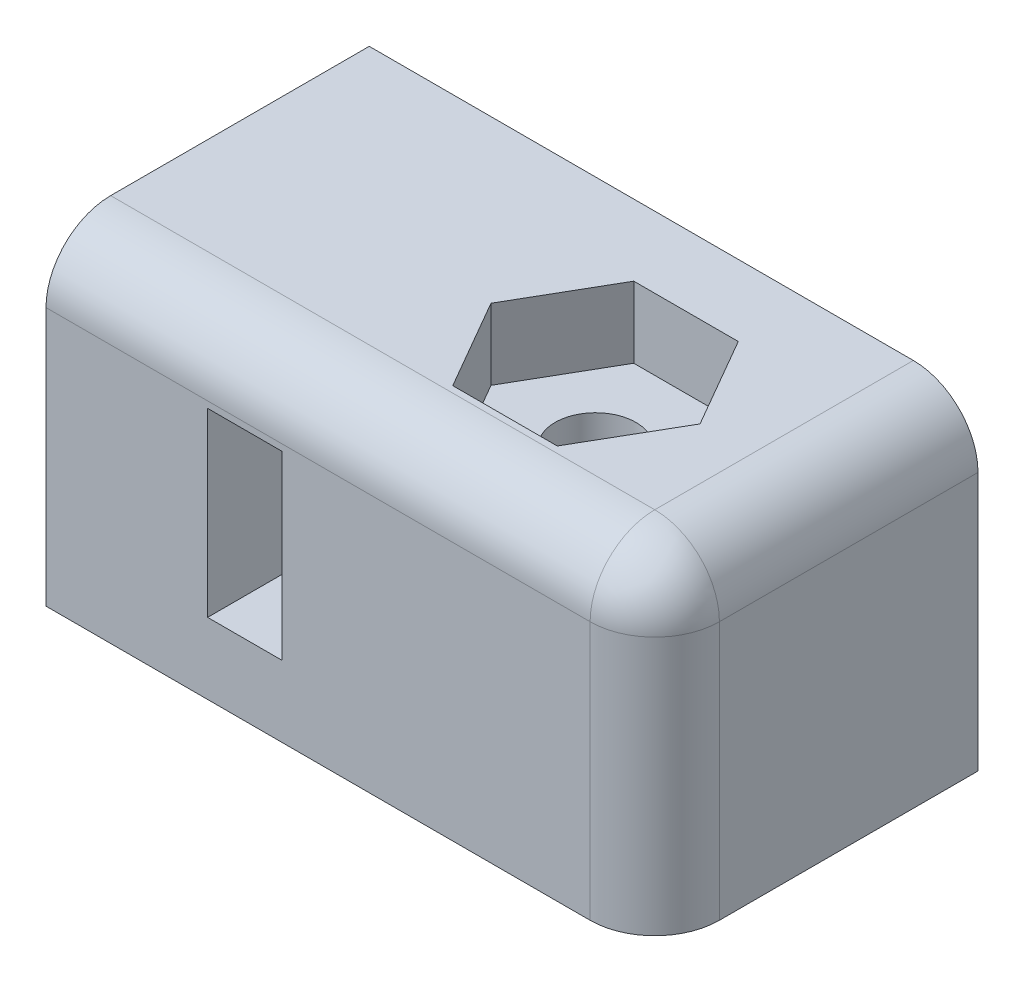
ISO-10303-21;
HEADER;
FILE_DESCRIPTION(('STEP AP214'),'2;1');
FILE_NAME('part.step','',(''),(''),'','','');
FILE_SCHEMA(('AUTOMOTIVE_DESIGN { 1 0 10303 214 1 1 1 1 }'));
ENDSEC;
DATA;
#1=APPLICATION_CONTEXT('core data for automotive mechanical design processes');
#2=APPLICATION_PROTOCOL_DEFINITION('international standard','automotive_design',2000,#1);
#3=PRODUCT_CONTEXT('',#1,'mechanical');
#4=PRODUCT('Part','Part','',(#3));
#5=PRODUCT_RELATED_PRODUCT_CATEGORY('part','',(#4));
#6=PRODUCT_DEFINITION_FORMATION('','',#4);
#7=PRODUCT_DEFINITION_CONTEXT('part definition',#1,'design');
#8=PRODUCT_DEFINITION('design','',#6,#7);
#9=PRODUCT_DEFINITION_SHAPE('','',#8);
#10=(LENGTH_UNIT() NAMED_UNIT(*) SI_UNIT(.MILLI.,.METRE.));
#11=(NAMED_UNIT(*) PLANE_ANGLE_UNIT() SI_UNIT($,.RADIAN.));
#12=(NAMED_UNIT(*) SI_UNIT($,.STERADIAN.) SOLID_ANGLE_UNIT());
#13=UNCERTAINTY_MEASURE_WITH_UNIT(LENGTH_MEASURE(1.E-05),#10,'distance_accuracy_value','');
#14=(GEOMETRIC_REPRESENTATION_CONTEXT(3) GLOBAL_UNCERTAINTY_ASSIGNED_CONTEXT((#13)) GLOBAL_UNIT_ASSIGNED_CONTEXT((#10,
#11,#12)) REPRESENTATION_CONTEXT('',''));
#15=CARTESIAN_POINT('',(0.,0.,0.));
#16=DIRECTION('',(0.,0.,1.));
#17=DIRECTION('',(1.,0.,0.));
#18=AXIS2_PLACEMENT_3D('',#15,#16,#17);
#19=CARTESIAN_POINT('',(12.,5.,-5.00000000000001));
#20=DIRECTION('',(-1.,0.,0.));
#21=DIRECTION('',(0.,0.,1.));
#22=AXIS2_PLACEMENT_3D('',#19,#20,#21);
#23=CYLINDRICAL_SURFACE('',#22,1.25);
#24=CARTESIAN_POINT('',(7.3,5.,-5.00000000000001));
#25=DIRECTION('',(1.,0.,0.));
#26=DIRECTION('',(0.,0.,-1.));
#27=AXIS2_PLACEMENT_3D('',#24,#25,#26);
#28=CIRCLE('',#27,1.25);
#29=CARTESIAN_POINT('',(7.3,5.,-6.25000000000001));
#30=VERTEX_POINT('',#29);
#31=EDGE_CURVE('E204',#30,#30,#28,.F.);
#32=ORIENTED_EDGE('',*,*,#31,.T.);
#33=EDGE_LOOP('',(#32));
#34=FACE_BOUND('',#33,.T.);
#35=CARTESIAN_POINT('',(12.,5.,-5.00000000000001));
#36=DIRECTION('',(0.707106781186547,0.707106781186547,0.));
#37=DIRECTION('',(-0.707106781186547,0.707106781186547,0.));
#38=AXIS2_PLACEMENT_3D('',#35,#36,#37);
#39=ELLIPSE('',#38,1.76776695296637,1.25);
#40=CARTESIAN_POINT('',(12.,5.,-3.75));
#41=VERTEX_POINT('',#40);
#42=CARTESIAN_POINT('',(12.,5.,-6.25));
#43=VERTEX_POINT('',#42);
#44=EDGE_CURVE('E191',#41,#43,#39,.F.);
#45=ORIENTED_EDGE('',*,*,#44,.F.);
#46=CARTESIAN_POINT('',(12.,5.,-5.00000000000001));
#47=DIRECTION('',(-0.707106781186547,0.707106781186547,0.));
#48=DIRECTION('',(0.707106781186547,0.707106781186547,0.));
#49=AXIS2_PLACEMENT_3D('',#46,#47,#48);
#50=ELLIPSE('',#49,1.76776695296637,1.25);
#51=EDGE_CURVE('E169',#43,#41,#50,.T.);
#52=ORIENTED_EDGE('',*,*,#51,.F.);
#53=EDGE_LOOP('',(#45,#52));
#54=FACE_BOUND('',#53,.T.);
#55=ADVANCED_FACE('F34',(#34,#54),#23,.F.);
#56=CARTESIAN_POINT('',(12.,0.,-5.));
#57=DIRECTION('',(0.,1.,0.));
#58=DIRECTION('',(0.,0.,1.));
#59=AXIS2_PLACEMENT_3D('',#56,#57,#58);
#60=CYLINDRICAL_SURFACE('',#59,1.25);
#61=CARTESIAN_POINT('',(12.,0.,-5.));
#62=DIRECTION('',(0.,1.,0.));
#63=DIRECTION('',(0.,0.,1.));
#64=AXIS2_PLACEMENT_3D('',#61,#62,#63);
#65=CIRCLE('',#64,1.25);
#66=CARTESIAN_POINT('',(12.,0.,-3.75));
#67=VERTEX_POINT('',#66);
#68=EDGE_CURVE('E288',#67,#67,#65,.T.);
#69=ORIENTED_EDGE('',*,*,#68,.F.);
#70=EDGE_LOOP('',(#69));
#71=FACE_BOUND('',#70,.T.);
#72=ORIENTED_EDGE('',*,*,#44,.T.);
#73=ORIENTED_EDGE('',*,*,#51,.T.);
#74=EDGE_LOOP('',(#72,#73));
#75=FACE_BOUND('',#74,.T.);
#76=CARTESIAN_POINT('',(12.,7.8,-5.));
#77=DIRECTION('',(0.,1.,0.));
#78=DIRECTION('',(0.,0.,1.));
#79=AXIS2_PLACEMENT_3D('',#76,#77,#78);
#80=CIRCLE('',#79,1.25);
#81=CARTESIAN_POINT('',(12.,7.8,-3.75));
#82=VERTEX_POINT('',#81);
#83=EDGE_CURVE('E196',#82,#82,#80,.F.);
#84=ORIENTED_EDGE('',*,*,#83,.F.);
#85=EDGE_LOOP('',(#84));
#86=FACE_BOUND('',#85,.T.);
#87=ADVANCED_FACE('F261',(#71,#75,#86),#60,.F.);
#88=CARTESIAN_POINT('',(0.,10.,0.));
#89=DIRECTION('',(1.,0.,0.));
#90=DIRECTION('',(0.,0.,-1.));
#91=AXIS2_PLACEMENT_3D('',#88,#89,#90);
#92=PLANE('',#91);
#93=CARTESIAN_POINT('',(0.,5.,-5.));
#94=DIRECTION('',(-1.,0.,0.));
#95=DIRECTION('',(0.,0.,1.));
#96=AXIS2_PLACEMENT_3D('',#93,#94,#95);
#97=CIRCLE('',#96,1.25);
#98=CARTESIAN_POINT('',(0.,5.,-3.75));
#99=VERTEX_POINT('',#98);
#100=EDGE_CURVE('E199',#99,#99,#97,.T.);
#101=ORIENTED_EDGE('',*,*,#100,.F.);
#102=EDGE_LOOP('',(#101));
#103=FACE_BOUND('',#102,.T.);
#104=DIRECTION('',(0.,-1.,0.));
#105=VECTOR('',#104,1.);
#106=CARTESIAN_POINT('',(0.,10.,0.));
#107=LINE('',#106,#105);
#108=CARTESIAN_POINT('',(0.,8.,0.));
#109=VERTEX_POINT('',#108);
#110=CARTESIAN_POINT('',(0.,0.,0.));
#111=VERTEX_POINT('',#110);
#112=EDGE_CURVE('E189',#109,#111,#107,.T.);
#113=ORIENTED_EDGE('',*,*,#112,.F.);
#114=CARTESIAN_POINT('',(0.,8.,-2.));
#115=DIRECTION('',(1.,0.,0.));
#116=DIRECTION('',(0.,0.,-1.));
#117=AXIS2_PLACEMENT_3D('',#114,#115,#116);
#118=CIRCLE('',#117,2.);
#119=CARTESIAN_POINT('',(0.,10.,-2.));
#120=VERTEX_POINT('',#119);
#121=EDGE_CURVE('E221',#109,#120,#118,.F.);
#122=ORIENTED_EDGE('',*,*,#121,.T.);
#123=DIRECTION('',(0.,0.,1.));
#124=VECTOR('',#123,1.);
#125=CARTESIAN_POINT('',(0.,10.,0.));
#126=LINE('',#125,#124);
#127=CARTESIAN_POINT('',(0.,10.,-10.));
#128=VERTEX_POINT('',#127);
#129=EDGE_CURVE('E177',#128,#120,#126,.T.);
#130=ORIENTED_EDGE('',*,*,#129,.F.);
#131=DIRECTION('',(0.,-1.,0.));
#132=VECTOR('',#131,1.);
#133=CARTESIAN_POINT('',(0.,10.,-10.));
#134=LINE('',#133,#132);
#135=CARTESIAN_POINT('',(0.,0.,-10.));
#136=VERTEX_POINT('',#135);
#137=EDGE_CURVE('E187',#128,#136,#134,.T.);
#138=ORIENTED_EDGE('',*,*,#137,.T.);
#139=DIRECTION('',(0.,0.,1.));
#140=VECTOR('',#139,1.);
#141=CARTESIAN_POINT('',(0.,0.,0.));
#142=LINE('',#141,#140);
#143=EDGE_CURVE('E176',#136,#111,#142,.T.);
#144=ORIENTED_EDGE('',*,*,#143,.T.);
#145=EDGE_LOOP('',(#113,#122,#130,#138,#144));
#146=FACE_BOUND('',#145,.T.);
#147=ADVANCED_FACE('F244',(#103,#146),#92,.F.);
#148=CARTESIAN_POINT('',(0.,10.,0.));
#149=DIRECTION('',(0.,0.,-1.));
#150=DIRECTION('',(-1.,0.,0.));
#151=AXIS2_PLACEMENT_3D('',#148,#149,#150);
#152=PLANE('',#151);
#153=DIRECTION('',(-1.,0.,0.));
#154=VECTOR('',#153,1.);
#155=CARTESIAN_POINT('',(5.,7.8,0.));
#156=LINE('',#155,#154);
#157=CARTESIAN_POINT('',(7.3,7.8,0.));
#158=VERTEX_POINT('',#157);
#159=CARTESIAN_POINT('',(5.,7.8,0.));
#160=VERTEX_POINT('',#159);
#161=EDGE_CURVE('E356',#158,#160,#156,.T.);
#162=ORIENTED_EDGE('',*,*,#161,.F.);
#163=DIRECTION('',(0.,1.,0.));
#164=VECTOR('',#163,1.);
#165=CARTESIAN_POINT('',(7.3,2.2,0.));
#166=LINE('',#165,#164);
#167=CARTESIAN_POINT('',(7.3,2.2,0.));
#168=VERTEX_POINT('',#167);
#169=EDGE_CURVE('E160',#168,#158,#166,.T.);
#170=ORIENTED_EDGE('',*,*,#169,.F.);
#171=DIRECTION('',(1.,0.,0.));
#172=VECTOR('',#171,1.);
#173=CARTESIAN_POINT('',(5.,2.2,0.));
#174=LINE('',#173,#172);
#175=CARTESIAN_POINT('',(5.,2.2,0.));
#176=VERTEX_POINT('',#175);
#177=EDGE_CURVE('E349',#176,#168,#174,.T.);
#178=ORIENTED_EDGE('',*,*,#177,.F.);
#179=DIRECTION('',(0.,-1.,0.));
#180=VECTOR('',#179,1.);
#181=CARTESIAN_POINT('',(5.,2.2,0.));
#182=LINE('',#181,#180);
#183=EDGE_CURVE('E353',#160,#176,#182,.T.);
#184=ORIENTED_EDGE('',*,*,#183,.F.);
#185=EDGE_LOOP('',(#162,#170,#178,#184));
#186=FACE_BOUND('',#185,.T.);
#187=DIRECTION('',(0.,1.,0.));
#188=VECTOR('',#187,1.);
#189=CARTESIAN_POINT('',(16.8330708810255,10.,0.));
#190=LINE('',#189,#188);
#191=CARTESIAN_POINT('',(16.8330708810255,0.,0.));
#192=VERTEX_POINT('',#191);
#193=CARTESIAN_POINT('',(16.8330708810255,8.,0.));
#194=VERTEX_POINT('',#193);
#195=EDGE_CURVE('E168',#192,#194,#190,.T.);
#196=ORIENTED_EDGE('',*,*,#195,.T.);
#197=DIRECTION('',(1.,0.,0.));
#198=VECTOR('',#197,1.);
#199=CARTESIAN_POINT('',(0.,8.,0.));
#200=LINE('',#199,#198);
#201=EDGE_CURVE('E219',#194,#109,#200,.F.);
#202=ORIENTED_EDGE('',*,*,#201,.T.);
#203=ORIENTED_EDGE('',*,*,#112,.T.);
#204=DIRECTION('',(1.,0.,0.));
#205=VECTOR('',#204,1.);
#206=CARTESIAN_POINT('',(0.,0.,0.));
#207=LINE('',#206,#205);
#208=EDGE_CURVE('E178',#111,#192,#207,.T.);
#209=ORIENTED_EDGE('',*,*,#208,.T.);
#210=EDGE_LOOP('',(#196,#202,#203,#209));
#211=FACE_BOUND('',#210,.T.);
#212=ADVANCED_FACE('F246',(#186,#211),#152,.F.);
#213=CARTESIAN_POINT('',(0.,10.,-10.));
#214=DIRECTION('',(0.,0.,1.));
#215=DIRECTION('',(1.,0.,0.));
#216=AXIS2_PLACEMENT_3D('',#213,#214,#215);
#217=PLANE('',#216);
#218=DIRECTION('',(-1.,0.,0.));
#219=VECTOR('',#218,1.);
#220=CARTESIAN_POINT('',(0.,10.,-10.));
#221=LINE('',#220,#219);
#222=CARTESIAN_POINT('',(16.8330708810255,10.,-10.));
#223=VERTEX_POINT('',#222);
#224=EDGE_CURVE('E181',#223,#128,#221,.T.);
#225=ORIENTED_EDGE('',*,*,#224,.F.);
#226=CARTESIAN_POINT('',(16.8330708810255,8.,-10.));
#227=DIRECTION('',(0.,0.,1.));
#228=DIRECTION('',(1.,0.,0.));
#229=AXIS2_PLACEMENT_3D('',#226,#227,#228);
#230=CIRCLE('',#229,2.);
#231=CARTESIAN_POINT('',(18.8330708810256,8.,-10.));
#232=VERTEX_POINT('',#231);
#233=EDGE_CURVE('E11',#223,#232,#230,.F.);
#234=ORIENTED_EDGE('',*,*,#233,.T.);
#235=DIRECTION('',(0.,-1.,0.));
#236=VECTOR('',#235,1.);
#237=CARTESIAN_POINT('',(18.8330708810256,10.,-10.));
#238=LINE('',#237,#236);
#239=CARTESIAN_POINT('',(18.8330708810256,0.,-10.));
#240=VERTEX_POINT('',#239);
#241=EDGE_CURVE('E153',#232,#240,#238,.T.);
#242=ORIENTED_EDGE('',*,*,#241,.T.);
#243=DIRECTION('',(-1.,0.,0.));
#244=VECTOR('',#243,1.);
#245=CARTESIAN_POINT('',(0.,0.,-10.));
#246=LINE('',#245,#244);
#247=EDGE_CURVE('E158',#240,#136,#246,.T.);
#248=ORIENTED_EDGE('',*,*,#247,.T.);
#249=ORIENTED_EDGE('',*,*,#137,.F.);
#250=EDGE_LOOP('',(#225,#234,#242,#248,#249));
#251=FACE_BOUND('',#250,.T.);
#252=ADVANCED_FACE('F155',(#251),#217,.F.);
#253=CARTESIAN_POINT('',(0.,10.,0.));
#254=DIRECTION('',(0.,-1.,0.));
#255=DIRECTION('',(0.,0.,-1.));
#256=AXIS2_PLACEMENT_3D('',#253,#254,#255);
#257=PLANE('',#256);
#258=DIRECTION('',(0.5,0.,-0.866025403784439));
#259=VECTOR('',#258,1.);
#260=CARTESIAN_POINT('',(13.616580753731,10.,-2.2));
#261=LINE('',#260,#259);
#262=CARTESIAN_POINT('',(13.616580753731,10.,-2.2));
#263=VERTEX_POINT('',#262);
#264=CARTESIAN_POINT('',(15.2331615074619,10.,-5.));
#265=VERTEX_POINT('',#264);
#266=EDGE_CURVE('E320',#263,#265,#261,.T.);
#267=ORIENTED_EDGE('',*,*,#266,.F.);
#268=DIRECTION('',(1.,0.,0.));
#269=VECTOR('',#268,1.);
#270=CARTESIAN_POINT('',(10.383419246269,10.,-2.2));
#271=LINE('',#270,#269);
#272=CARTESIAN_POINT('',(10.383419246269,10.,-2.2));
#273=VERTEX_POINT('',#272);
#274=EDGE_CURVE('E207',#273,#263,#271,.T.);
#275=ORIENTED_EDGE('',*,*,#274,.F.);
#276=DIRECTION('',(0.5,0.,0.866025403784439));
#277=VECTOR('',#276,1.);
#278=CARTESIAN_POINT('',(8.7668384925381,10.,-5.));
#279=LINE('',#278,#277);
#280=CARTESIAN_POINT('',(8.7668384925381,10.,-5.));
#281=VERTEX_POINT('',#280);
#282=EDGE_CURVE('E307',#281,#273,#279,.T.);
#283=ORIENTED_EDGE('',*,*,#282,.F.);
#284=DIRECTION('',(-0.5,0.,0.866025403784439));
#285=VECTOR('',#284,1.);
#286=CARTESIAN_POINT('',(10.383419246269,10.,-7.8));
#287=LINE('',#286,#285);
#288=CARTESIAN_POINT('',(10.383419246269,10.,-7.8));
#289=VERTEX_POINT('',#288);
#290=EDGE_CURVE('E311',#289,#281,#287,.T.);
#291=ORIENTED_EDGE('',*,*,#290,.F.);
#292=DIRECTION('',(-1.,0.,0.));
#293=VECTOR('',#292,1.);
#294=CARTESIAN_POINT('',(13.616580753731,10.,-7.8));
#295=LINE('',#294,#293);
#296=CARTESIAN_POINT('',(13.616580753731,10.,-7.8));
#297=VERTEX_POINT('',#296);
#298=EDGE_CURVE('E314',#297,#289,#295,.T.);
#299=ORIENTED_EDGE('',*,*,#298,.F.);
#300=DIRECTION('',(-0.5,0.,-0.866025403784439));
#301=VECTOR('',#300,1.);
#302=CARTESIAN_POINT('',(15.2331615074619,10.,-5.));
#303=LINE('',#302,#301);
#304=EDGE_CURVE('E317',#265,#297,#303,.T.);
#305=ORIENTED_EDGE('',*,*,#304,.F.);
#306=EDGE_LOOP('',(#267,#275,#283,#291,#299,#305));
#307=FACE_BOUND('',#306,.T.);
#308=ORIENTED_EDGE('',*,*,#129,.T.);
#309=DIRECTION('',(1.,0.,0.));
#310=VECTOR('',#309,1.);
#311=CARTESIAN_POINT('',(0.,10.,-2.));
#312=LINE('',#311,#310);
#313=CARTESIAN_POINT('',(16.8330708810255,10.,-2.));
#314=VERTEX_POINT('',#313);
#315=EDGE_CURVE('E216',#120,#314,#312,.T.);
#316=ORIENTED_EDGE('',*,*,#315,.T.);
#317=DIRECTION('',(0.,0.,1.));
#318=VECTOR('',#317,1.);
#319=CARTESIAN_POINT('',(16.8330708810255,10.,0.));
#320=LINE('',#319,#318);
#321=EDGE_CURVE('E214',#314,#223,#320,.F.);
#322=ORIENTED_EDGE('',*,*,#321,.T.);
#323=ORIENTED_EDGE('',*,*,#224,.T.);
#324=EDGE_LOOP('',(#308,#316,#322,#323));
#325=FACE_BOUND('',#324,.T.);
#326=ADVANCED_FACE('F238',(#307,#325),#257,.F.);
#327=CARTESIAN_POINT('',(0.,0.,0.));
#328=DIRECTION('',(0.,-1.,0.));
#329=DIRECTION('',(0.,0.,-1.));
#330=AXIS2_PLACEMENT_3D('',#327,#328,#329);
#331=PLANE('',#330);
#332=DIRECTION('',(0.,0.,-1.));
#333=VECTOR('',#332,1.);
#334=CARTESIAN_POINT('',(18.8330708810256,0.,0.));
#335=LINE('',#334,#333);
#336=CARTESIAN_POINT('',(18.8330708810256,0.,-2.));
#337=VERTEX_POINT('',#336);
#338=EDGE_CURVE('E163',#337,#240,#335,.T.);
#339=ORIENTED_EDGE('',*,*,#338,.F.);
#340=CARTESIAN_POINT('',(16.8330708810255,0.,-2.));
#341=DIRECTION('',(0.,-1.,0.));
#342=DIRECTION('',(0.,0.,-1.));
#343=AXIS2_PLACEMENT_3D('',#340,#341,#342);
#344=CIRCLE('',#343,2.);
#345=EDGE_CURVE('E212',#337,#192,#344,.T.);
#346=ORIENTED_EDGE('',*,*,#345,.T.);
#347=ORIENTED_EDGE('',*,*,#208,.F.);
#348=ORIENTED_EDGE('',*,*,#143,.F.);
#349=ORIENTED_EDGE('',*,*,#247,.F.);
#350=EDGE_LOOP('',(#339,#346,#347,#348,#349));
#351=FACE_BOUND('',#350,.T.);
#352=ORIENTED_EDGE('',*,*,#68,.T.);
#353=EDGE_LOOP('',(#352));
#354=FACE_BOUND('',#353,.T.);
#355=ADVANCED_FACE('F172',(#351,#354),#331,.T.);
#356=CARTESIAN_POINT('',(5.,5.,-5.));
#357=DIRECTION('',(-1.,0.,0.));
#358=DIRECTION('',(0.,0.,1.));
#359=AXIS2_PLACEMENT_3D('',#356,#357,#358);
#360=CIRCLE('',#359,1.25);
#361=CARTESIAN_POINT('',(5.,5.,-3.75));
#362=VERTEX_POINT('',#361);
#363=EDGE_CURVE('E201',#362,#362,#360,.F.);
#364=ORIENTED_EDGE('',*,*,#363,.T.);
#365=EDGE_LOOP('',(#364));
#366=FACE_BOUND('',#365,.T.);
#367=ORIENTED_EDGE('',*,*,#100,.T.);
#368=EDGE_LOOP('',(#367));
#369=FACE_BOUND('',#368,.T.);
#370=ADVANCED_FACE('F264',(#366,#369),#23,.F.);
#371=CARTESIAN_POINT('',(0.,7.8,0.));
#372=DIRECTION('',(0.,1.,0.));
#373=DIRECTION('',(0.,0.,1.));
#374=AXIS2_PLACEMENT_3D('',#371,#372,#373);
#375=PLANE('',#374);
#376=DIRECTION('',(1.,0.,0.));
#377=VECTOR('',#376,1.);
#378=CARTESIAN_POINT('',(10.383419246269,7.8,-2.2));
#379=LINE('',#378,#377);
#380=CARTESIAN_POINT('',(10.383419246269,7.8,-2.2));
#381=VERTEX_POINT('',#380);
#382=CARTESIAN_POINT('',(13.616580753731,7.8,-2.2));
#383=VERTEX_POINT('',#382);
#384=EDGE_CURVE('E310',#381,#383,#379,.T.);
#385=ORIENTED_EDGE('',*,*,#384,.T.);
#386=DIRECTION('',(0.5,0.,-0.866025403784439));
#387=VECTOR('',#386,1.);
#388=CARTESIAN_POINT('',(13.616580753731,7.8,-2.2));
#389=LINE('',#388,#387);
#390=CARTESIAN_POINT('',(15.2331615074619,7.8,-5.));
#391=VERTEX_POINT('',#390);
#392=EDGE_CURVE('E335',#383,#391,#389,.T.);
#393=ORIENTED_EDGE('',*,*,#392,.T.);
#394=DIRECTION('',(-0.5,0.,-0.866025403784439));
#395=VECTOR('',#394,1.);
#396=CARTESIAN_POINT('',(15.2331615074619,7.8,-5.));
#397=LINE('',#396,#395);
#398=CARTESIAN_POINT('',(13.616580753731,7.8,-7.8));
#399=VERTEX_POINT('',#398);
#400=EDGE_CURVE('E332',#391,#399,#397,.T.);
#401=ORIENTED_EDGE('',*,*,#400,.T.);
#402=DIRECTION('',(-1.,0.,0.));
#403=VECTOR('',#402,1.);
#404=CARTESIAN_POINT('',(13.616580753731,7.8,-7.8));
#405=LINE('',#404,#403);
#406=CARTESIAN_POINT('',(10.383419246269,7.8,-7.8));
#407=VERTEX_POINT('',#406);
#408=EDGE_CURVE('E329',#399,#407,#405,.T.);
#409=ORIENTED_EDGE('',*,*,#408,.T.);
#410=DIRECTION('',(-0.5,0.,0.866025403784439));
#411=VECTOR('',#410,1.);
#412=CARTESIAN_POINT('',(10.383419246269,7.8,-7.8));
#413=LINE('',#412,#411);
#414=CARTESIAN_POINT('',(8.7668384925381,7.8,-5.));
#415=VERTEX_POINT('',#414);
#416=EDGE_CURVE('E326',#407,#415,#413,.T.);
#417=ORIENTED_EDGE('',*,*,#416,.T.);
#418=DIRECTION('',(0.5,0.,0.866025403784439));
#419=VECTOR('',#418,1.);
#420=CARTESIAN_POINT('',(8.7668384925381,7.8,-5.));
#421=LINE('',#420,#419);
#422=EDGE_CURVE('E298',#415,#381,#421,.T.);
#423=ORIENTED_EDGE('',*,*,#422,.T.);
#424=EDGE_LOOP('',(#385,#393,#401,#409,#417,#423));
#425=FACE_BOUND('',#424,.T.);
#426=ORIENTED_EDGE('',*,*,#83,.T.);
#427=EDGE_LOOP('',(#426));
#428=FACE_BOUND('',#427,.T.);
#429=ADVANCED_FACE('F273',(#425,#428),#375,.T.);
#430=CARTESIAN_POINT('',(10.383419246269,7.8,-2.2));
#431=DIRECTION('',(0.,0.,1.));
#432=DIRECTION('',(1.,0.,0.));
#433=AXIS2_PLACEMENT_3D('',#430,#431,#432);
#434=PLANE('',#433);
#435=ORIENTED_EDGE('',*,*,#274,.T.);
#436=DIRECTION('',(0.,1.,0.));
#437=VECTOR('',#436,1.);
#438=CARTESIAN_POINT('',(13.616580753731,7.8,-2.2));
#439=LINE('',#438,#437);
#440=EDGE_CURVE('E293',#383,#263,#439,.T.);
#441=ORIENTED_EDGE('',*,*,#440,.F.);
#442=ORIENTED_EDGE('',*,*,#384,.F.);
#443=DIRECTION('',(0.,1.,0.));
#444=VECTOR('',#443,1.);
#445=CARTESIAN_POINT('',(10.383419246269,7.8,-2.2));
#446=LINE('',#445,#444);
#447=EDGE_CURVE('E200',#381,#273,#446,.T.);
#448=ORIENTED_EDGE('',*,*,#447,.T.);
#449=EDGE_LOOP('',(#435,#441,#442,#448));
#450=FACE_BOUND('',#449,.T.);
#451=ADVANCED_FACE('F279',(#450),#434,.F.);
#452=CARTESIAN_POINT('',(8.7668384925381,7.8,-5.));
#453=DIRECTION('',(-0.866025403784439,0.,0.5));
#454=DIRECTION('',(0.5,0.,0.866025403784439));
#455=AXIS2_PLACEMENT_3D('',#452,#453,#454);
#456=PLANE('',#455);
#457=ORIENTED_EDGE('',*,*,#282,.T.);
#458=ORIENTED_EDGE('',*,*,#447,.F.);
#459=ORIENTED_EDGE('',*,*,#422,.F.);
#460=DIRECTION('',(0.,1.,0.));
#461=VECTOR('',#460,1.);
#462=CARTESIAN_POINT('',(8.7668384925381,7.8,-5.));
#463=LINE('',#462,#461);
#464=EDGE_CURVE('E304',#415,#281,#463,.T.);
#465=ORIENTED_EDGE('',*,*,#464,.T.);
#466=EDGE_LOOP('',(#457,#458,#459,#465));
#467=FACE_BOUND('',#466,.T.);
#468=ADVANCED_FACE('F414',(#467),#456,.F.);
#469=CARTESIAN_POINT('',(10.383419246269,7.8,-7.8));
#470=DIRECTION('',(-0.866025403784439,0.,-0.5));
#471=DIRECTION('',(-0.5,0.,0.866025403784439));
#472=AXIS2_PLACEMENT_3D('',#469,#470,#471);
#473=PLANE('',#472);
#474=ORIENTED_EDGE('',*,*,#290,.T.);
#475=ORIENTED_EDGE('',*,*,#464,.F.);
#476=ORIENTED_EDGE('',*,*,#416,.F.);
#477=DIRECTION('',(0.,1.,0.));
#478=VECTOR('',#477,1.);
#479=CARTESIAN_POINT('',(10.383419246269,7.8,-7.8));
#480=LINE('',#479,#478);
#481=EDGE_CURVE('E302',#407,#289,#480,.T.);
#482=ORIENTED_EDGE('',*,*,#481,.T.);
#483=EDGE_LOOP('',(#474,#475,#476,#482));
#484=FACE_BOUND('',#483,.T.);
#485=ADVANCED_FACE('F417',(#484),#473,.F.);
#486=CARTESIAN_POINT('',(13.616580753731,7.8,-7.8));
#487=DIRECTION('',(0.,0.,-1.));
#488=DIRECTION('',(-1.,0.,0.));
#489=AXIS2_PLACEMENT_3D('',#486,#487,#488);
#490=PLANE('',#489);
#491=ORIENTED_EDGE('',*,*,#298,.T.);
#492=ORIENTED_EDGE('',*,*,#481,.F.);
#493=ORIENTED_EDGE('',*,*,#408,.F.);
#494=DIRECTION('',(0.,1.,0.));
#495=VECTOR('',#494,1.);
#496=CARTESIAN_POINT('',(13.616580753731,7.8,-7.8));
#497=LINE('',#496,#495);
#498=EDGE_CURVE('E300',#399,#297,#497,.T.);
#499=ORIENTED_EDGE('',*,*,#498,.T.);
#500=EDGE_LOOP('',(#491,#492,#493,#499));
#501=FACE_BOUND('',#500,.T.);
#502=ADVANCED_FACE('F421',(#501),#490,.F.);
#503=CARTESIAN_POINT('',(15.2331615074619,7.8,-5.));
#504=DIRECTION('',(0.866025403784439,0.,-0.5));
#505=DIRECTION('',(-0.5,0.,-0.866025403784439));
#506=AXIS2_PLACEMENT_3D('',#503,#504,#505);
#507=PLANE('',#506);
#508=ORIENTED_EDGE('',*,*,#304,.T.);
#509=ORIENTED_EDGE('',*,*,#498,.F.);
#510=ORIENTED_EDGE('',*,*,#400,.F.);
#511=DIRECTION('',(0.,1.,0.));
#512=VECTOR('',#511,1.);
#513=CARTESIAN_POINT('',(15.2331615074619,7.8,-5.));
#514=LINE('',#513,#512);
#515=EDGE_CURVE('E297',#391,#265,#514,.T.);
#516=ORIENTED_EDGE('',*,*,#515,.T.);
#517=EDGE_LOOP('',(#508,#509,#510,#516));
#518=FACE_BOUND('',#517,.T.);
#519=ADVANCED_FACE('F423',(#518),#507,.F.);
#520=CARTESIAN_POINT('',(13.616580753731,7.8,-2.2));
#521=DIRECTION('',(0.866025403784439,0.,0.5));
#522=DIRECTION('',(0.5,0.,-0.866025403784439));
#523=AXIS2_PLACEMENT_3D('',#520,#521,#522);
#524=PLANE('',#523);
#525=ORIENTED_EDGE('',*,*,#266,.T.);
#526=ORIENTED_EDGE('',*,*,#515,.F.);
#527=ORIENTED_EDGE('',*,*,#392,.F.);
#528=ORIENTED_EDGE('',*,*,#440,.T.);
#529=EDGE_LOOP('',(#525,#526,#527,#528));
#530=FACE_BOUND('',#529,.T.);
#531=ADVANCED_FACE('F407',(#530),#524,.F.);
#532=CARTESIAN_POINT('',(7.3,2.2,-7.3));
#533=DIRECTION('',(1.,0.,0.));
#534=DIRECTION('',(0.,0.,-1.));
#535=AXIS2_PLACEMENT_3D('',#532,#533,#534);
#536=PLANE('',#535);
#537=ORIENTED_EDGE('',*,*,#169,.T.);
#538=DIRECTION('',(0.,0.,1.));
#539=VECTOR('',#538,1.);
#540=CARTESIAN_POINT('',(7.3,7.8,-7.3));
#541=LINE('',#540,#539);
#542=CARTESIAN_POINT('',(7.3,7.8,-7.3));
#543=VERTEX_POINT('',#542);
#544=EDGE_CURVE('E340',#543,#158,#541,.T.);
#545=ORIENTED_EDGE('',*,*,#544,.F.);
#546=DIRECTION('',(0.,1.,0.));
#547=VECTOR('',#546,1.);
#548=CARTESIAN_POINT('',(7.3,2.2,-7.3));
#549=LINE('',#548,#547);
#550=CARTESIAN_POINT('',(7.3,2.2,-7.3));
#551=VERTEX_POINT('',#550);
#552=EDGE_CURVE('E352',#551,#543,#549,.T.);
#553=ORIENTED_EDGE('',*,*,#552,.F.);
#554=DIRECTION('',(0.,0.,1.));
#555=VECTOR('',#554,1.);
#556=CARTESIAN_POINT('',(7.3,2.2,-7.3));
#557=LINE('',#556,#555);
#558=EDGE_CURVE('E205',#551,#168,#557,.T.);
#559=ORIENTED_EDGE('',*,*,#558,.T.);
#560=EDGE_LOOP('',(#537,#545,#553,#559));
#561=FACE_BOUND('',#560,.T.);
#562=ORIENTED_EDGE('',*,*,#31,.F.);
#563=EDGE_LOOP('',(#562));
#564=FACE_BOUND('',#563,.T.);
#565=ADVANCED_FACE('F374',(#561,#564),#536,.F.);
#566=CARTESIAN_POINT('',(5.,2.2,-7.3));
#567=DIRECTION('',(-1.,0.,0.));
#568=DIRECTION('',(0.,0.,1.));
#569=AXIS2_PLACEMENT_3D('',#566,#567,#568);
#570=PLANE('',#569);
#571=ORIENTED_EDGE('',*,*,#183,.T.);
#572=DIRECTION('',(0.,0.,1.));
#573=VECTOR('',#572,1.);
#574=CARTESIAN_POINT('',(5.,2.2,-7.3));
#575=LINE('',#574,#573);
#576=CARTESIAN_POINT('',(5.,2.2,-7.3));
#577=VERTEX_POINT('',#576);
#578=EDGE_CURVE('E346',#577,#176,#575,.T.);
#579=ORIENTED_EDGE('',*,*,#578,.F.);
#580=DIRECTION('',(0.,-1.,0.));
#581=VECTOR('',#580,1.);
#582=CARTESIAN_POINT('',(5.,2.2,-7.3));
#583=LINE('',#582,#581);
#584=CARTESIAN_POINT('',(5.,7.8,-7.3));
#585=VERTEX_POINT('',#584);
#586=EDGE_CURVE('E362',#585,#577,#583,.T.);
#587=ORIENTED_EDGE('',*,*,#586,.F.);
#588=DIRECTION('',(0.,0.,1.));
#589=VECTOR('',#588,1.);
#590=CARTESIAN_POINT('',(5.,7.8,-7.3));
#591=LINE('',#590,#589);
#592=EDGE_CURVE('E343',#585,#160,#591,.T.);
#593=ORIENTED_EDGE('',*,*,#592,.T.);
#594=EDGE_LOOP('',(#571,#579,#587,#593));
#595=FACE_BOUND('',#594,.T.);
#596=ORIENTED_EDGE('',*,*,#363,.F.);
#597=EDGE_LOOP('',(#596));
#598=FACE_BOUND('',#597,.T.);
#599=ADVANCED_FACE('F383',(#595,#598),#570,.F.);
#600=CARTESIAN_POINT('',(5.,2.2,-7.3));
#601=DIRECTION('',(0.,-1.,0.));
#602=DIRECTION('',(0.,0.,-1.));
#603=AXIS2_PLACEMENT_3D('',#600,#601,#602);
#604=PLANE('',#603);
#605=ORIENTED_EDGE('',*,*,#177,.T.);
#606=ORIENTED_EDGE('',*,*,#558,.F.);
#607=DIRECTION('',(1.,0.,0.));
#608=VECTOR('',#607,1.);
#609=CARTESIAN_POINT('',(5.,2.2,-7.3));
#610=LINE('',#609,#608);
#611=EDGE_CURVE('E344',#577,#551,#610,.T.);
#612=ORIENTED_EDGE('',*,*,#611,.F.);
#613=ORIENTED_EDGE('',*,*,#578,.T.);
#614=EDGE_LOOP('',(#605,#606,#612,#613));
#615=FACE_BOUND('',#614,.T.);
#616=ADVANCED_FACE('F386',(#615),#604,.F.);
#617=CARTESIAN_POINT('',(5.,7.8,-7.3));
#618=DIRECTION('',(0.,1.,0.));
#619=DIRECTION('',(0.,0.,1.));
#620=AXIS2_PLACEMENT_3D('',#617,#618,#619);
#621=PLANE('',#620);
#622=ORIENTED_EDGE('',*,*,#161,.T.);
#623=ORIENTED_EDGE('',*,*,#592,.F.);
#624=DIRECTION('',(-1.,0.,0.));
#625=VECTOR('',#624,1.);
#626=CARTESIAN_POINT('',(5.,7.8,-7.3));
#627=LINE('',#626,#625);
#628=EDGE_CURVE('E365',#543,#585,#627,.T.);
#629=ORIENTED_EDGE('',*,*,#628,.F.);
#630=ORIENTED_EDGE('',*,*,#544,.T.);
#631=EDGE_LOOP('',(#622,#623,#629,#630));
#632=FACE_BOUND('',#631,.T.);
#633=ADVANCED_FACE('F379',(#632),#621,.F.);
#634=CARTESIAN_POINT('',(0.,0.,-7.3));
#635=DIRECTION('',(0.,0.,-1.));
#636=DIRECTION('',(-1.,0.,0.));
#637=AXIS2_PLACEMENT_3D('',#634,#635,#636);
#638=PLANE('',#637);
#639=ORIENTED_EDGE('',*,*,#552,.T.);
#640=ORIENTED_EDGE('',*,*,#628,.T.);
#641=ORIENTED_EDGE('',*,*,#586,.T.);
#642=ORIENTED_EDGE('',*,*,#611,.T.);
#643=EDGE_LOOP('',(#639,#640,#641,#642));
#644=FACE_BOUND('',#643,.T.);
#645=ADVANCED_FACE('F256',(#644),#638,.F.);
#646=CARTESIAN_POINT('',(18.8330708810256,-2.,-11.2153695254834));
#647=DIRECTION('',(-1.,0.,0.));
#648=DIRECTION('',(0.,0.,1.));
#649=AXIS2_PLACEMENT_3D('',#646,#647,#648);
#650=PLANE('',#649);
#651=ORIENTED_EDGE('',*,*,#241,.F.);
#652=DIRECTION('',(0.,0.,1.));
#653=VECTOR('',#652,1.);
#654=CARTESIAN_POINT('',(18.8330708810256,8.,-11.2153695254834));
#655=LINE('',#654,#653);
#656=CARTESIAN_POINT('',(18.8330708810256,8.,-2.));
#657=VERTEX_POINT('',#656);
#658=EDGE_CURVE('E43',#232,#657,#655,.T.);
#659=ORIENTED_EDGE('',*,*,#658,.T.);
#660=DIRECTION('',(0.,1.,0.));
#661=VECTOR('',#660,1.);
#662=CARTESIAN_POINT('',(18.8330708810256,-2.,-2.));
#663=LINE('',#662,#661);
#664=EDGE_CURVE('E165',#657,#337,#663,.F.);
#665=ORIENTED_EDGE('',*,*,#664,.T.);
#666=ORIENTED_EDGE('',*,*,#338,.T.);
#667=EDGE_LOOP('',(#651,#659,#665,#666));
#668=FACE_BOUND('',#667,.T.);
#669=ADVANCED_FACE('F164',(#668),#650,.F.);
#670=CARTESIAN_POINT('',(16.8330708810255,10.,-2.));
#671=DIRECTION('',(0.,1.,0.));
#672=DIRECTION('',(0.,0.,1.));
#673=AXIS2_PLACEMENT_3D('',#670,#671,#672);
#674=CYLINDRICAL_SURFACE('',#673,2.);
#675=ORIENTED_EDGE('',*,*,#664,.F.);
#676=CARTESIAN_POINT('',(16.8330708810255,8.,-2.));
#677=DIRECTION('',(0.,1.,0.));
#678=DIRECTION('',(0.,0.,1.));
#679=AXIS2_PLACEMENT_3D('',#676,#677,#678);
#680=CIRCLE('',#679,2.);
#681=EDGE_CURVE('E223',#657,#194,#680,.F.);
#682=ORIENTED_EDGE('',*,*,#681,.T.);
#683=ORIENTED_EDGE('',*,*,#195,.F.);
#684=ORIENTED_EDGE('',*,*,#345,.F.);
#685=EDGE_LOOP('',(#675,#682,#683,#684));
#686=FACE_BOUND('',#685,.T.);
#687=ADVANCED_FACE('F249',(#686),#674,.T.);
#688=CARTESIAN_POINT('',(16.8330708810255,8.,-11.2153695254834));
#689=DIRECTION('',(0.,0.,1.));
#690=DIRECTION('',(1.,0.,0.));
#691=AXIS2_PLACEMENT_3D('',#688,#689,#690);
#692=CYLINDRICAL_SURFACE('',#691,2.);
#693=CARTESIAN_POINT('',(16.8330708810255,8.,-2.));
#694=DIRECTION('',(0.,0.,1.));
#695=DIRECTION('',(1.,0.,0.));
#696=AXIS2_PLACEMENT_3D('',#693,#694,#695);
#697=CIRCLE('',#696,2.);
#698=EDGE_CURVE('E38',#657,#314,#697,.T.);
#699=ORIENTED_EDGE('',*,*,#698,.F.);
#700=ORIENTED_EDGE('',*,*,#658,.F.);
#701=ORIENTED_EDGE('',*,*,#233,.F.);
#702=ORIENTED_EDGE('',*,*,#321,.F.);
#703=EDGE_LOOP('',(#699,#700,#701,#702));
#704=FACE_BOUND('',#703,.T.);
#705=ADVANCED_FACE('F36',(#704),#692,.T.);
#706=CARTESIAN_POINT('',(16.8330708810255,8.,-2.));
#707=DIRECTION('',(0.,0.,1.));
#708=DIRECTION('',(1.,0.,0.));
#709=AXIS2_PLACEMENT_3D('',#706,#707,#708);
#710=SPHERICAL_SURFACE('',#709,2.);
#711=ORIENTED_EDGE('',*,*,#681,.F.);
#712=ORIENTED_EDGE('',*,*,#698,.T.);
#713=CARTESIAN_POINT('',(16.8330708810255,8.,-2.));
#714=DIRECTION('',(-1.,0.,0.));
#715=DIRECTION('',(0.,0.,1.));
#716=AXIS2_PLACEMENT_3D('',#713,#714,#715);
#717=CIRCLE('',#716,2.);
#718=EDGE_CURVE('E225',#194,#314,#717,.T.);
#719=ORIENTED_EDGE('',*,*,#718,.F.);
#720=EDGE_LOOP('',(#711,#712,#719));
#721=FACE_BOUND('',#720,.T.);
#722=ADVANCED_FACE('F235',(#721),#710,.T.);
#723=CARTESIAN_POINT('',(0.,8.,-2.));
#724=DIRECTION('',(1.,0.,0.));
#725=DIRECTION('',(0.,0.,-1.));
#726=AXIS2_PLACEMENT_3D('',#723,#724,#725);
#727=CYLINDRICAL_SURFACE('',#726,2.);
#728=ORIENTED_EDGE('',*,*,#121,.F.);
#729=ORIENTED_EDGE('',*,*,#201,.F.);
#730=ORIENTED_EDGE('',*,*,#718,.T.);
#731=ORIENTED_EDGE('',*,*,#315,.F.);
#732=EDGE_LOOP('',(#728,#729,#730,#731));
#733=FACE_BOUND('',#732,.T.);
#734=ADVANCED_FACE('F241',(#733),#727,.T.);
#735=CLOSED_SHELL('',(#55,#87,#147,#212,#252,#326,#355,#370,#429,#451,#468,#485,#502,#519,#531,
#565,#599,#616,#633,#645,#669,#687,#705,#722,#734));
#736=MANIFOLD_SOLID_BREP('B2',#735);
#737=ADVANCED_BREP_SHAPE_REPRESENTATION('',(#18,#736),#14);
#738=SHAPE_DEFINITION_REPRESENTATION(#9,#737);
ENDSEC;
END-ISO-10303-21;
